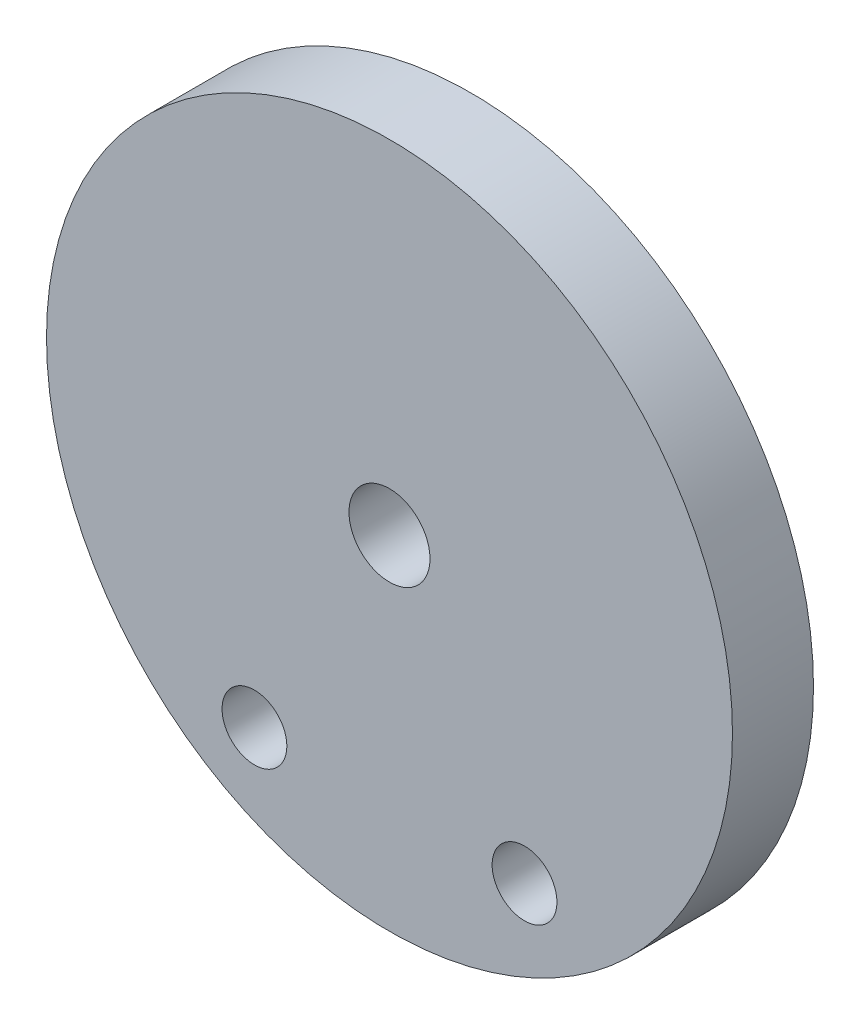
ISO-10303-21;
HEADER;
FILE_DESCRIPTION(('STEP AP214'),'2;1');
FILE_NAME('part.step','',(''),(''),'','','');
FILE_SCHEMA(('AUTOMOTIVE_DESIGN { 1 0 10303 214 1 1 1 1 }'));
ENDSEC;
DATA;
#1=APPLICATION_CONTEXT('core data for automotive mechanical design processes');
#2=APPLICATION_PROTOCOL_DEFINITION('international standard','automotive_design',2000,#1);
#3=PRODUCT_CONTEXT('',#1,'mechanical');
#4=PRODUCT('Part','Part','',(#3));
#5=PRODUCT_RELATED_PRODUCT_CATEGORY('part','',(#4));
#6=PRODUCT_DEFINITION_FORMATION('','',#4);
#7=PRODUCT_DEFINITION_CONTEXT('part definition',#1,'design');
#8=PRODUCT_DEFINITION('design','',#6,#7);
#9=PRODUCT_DEFINITION_SHAPE('','',#8);
#10=(LENGTH_UNIT() NAMED_UNIT(*) SI_UNIT(.MILLI.,.METRE.));
#11=(NAMED_UNIT(*) PLANE_ANGLE_UNIT() SI_UNIT($,.RADIAN.));
#12=(NAMED_UNIT(*) SI_UNIT($,.STERADIAN.) SOLID_ANGLE_UNIT());
#13=UNCERTAINTY_MEASURE_WITH_UNIT(LENGTH_MEASURE(1.E-05),#10,'distance_accuracy_value','');
#14=(GEOMETRIC_REPRESENTATION_CONTEXT(3) GLOBAL_UNCERTAINTY_ASSIGNED_CONTEXT((#13)) GLOBAL_UNIT_ASSIGNED_CONTEXT((#10,
#11,#12)) REPRESENTATION_CONTEXT('',''));
#15=CARTESIAN_POINT('',(0.,0.,0.));
#16=DIRECTION('',(0.,0.,1.));
#17=DIRECTION('',(1.,0.,0.));
#18=AXIS2_PLACEMENT_3D('',#15,#16,#17);
#19=CARTESIAN_POINT('',(0.,0.,3.));
#20=DIRECTION('',(0.,0.,1.));
#21=DIRECTION('',(1.,0.,0.));
#22=AXIS2_PLACEMENT_3D('',#19,#20,#21);
#23=PLANE('',#22);
#24=CARTESIAN_POINT('',(5.,-8.66,3.));
#25=DIRECTION('',(0.,0.,1.));
#26=DIRECTION('',(1.,0.,0.));
#27=AXIS2_PLACEMENT_3D('',#24,#25,#26);
#28=CIRCLE('',#27,1.2);
#29=CARTESIAN_POINT('',(6.2,-8.66,3.));
#30=VERTEX_POINT('',#29);
#31=EDGE_CURVE('E52',#30,#30,#28,.T.);
#32=ORIENTED_EDGE('',*,*,#31,.F.);
#33=EDGE_LOOP('',(#32));
#34=FACE_BOUND('',#33,.T.);
#35=CARTESIAN_POINT('',(0.,0.,3.));
#36=DIRECTION('',(0.,0.,1.));
#37=DIRECTION('',(1.,0.,0.));
#38=AXIS2_PLACEMENT_3D('',#35,#36,#37);
#39=CIRCLE('',#38,12.7);
#40=CARTESIAN_POINT('',(12.7,0.,3.));
#41=VERTEX_POINT('',#40);
#42=EDGE_CURVE('E10',#41,#41,#39,.T.);
#43=ORIENTED_EDGE('',*,*,#42,.T.);
#44=EDGE_LOOP('',(#43));
#45=FACE_BOUND('',#44,.T.);
#46=CARTESIAN_POINT('',(0.,0.,3.));
#47=DIRECTION('',(0.,0.,1.));
#48=DIRECTION('',(1.,0.,0.));
#49=AXIS2_PLACEMENT_3D('',#46,#47,#48);
#50=CIRCLE('',#49,1.5);
#51=CARTESIAN_POINT('',(1.5,0.,3.));
#52=VERTEX_POINT('',#51);
#53=EDGE_CURVE('E48',#52,#52,#50,.T.);
#54=ORIENTED_EDGE('',*,*,#53,.F.);
#55=EDGE_LOOP('',(#54));
#56=FACE_BOUND('',#55,.T.);
#57=CARTESIAN_POINT('',(-5.,-8.66,3.));
#58=DIRECTION('',(0.,0.,1.));
#59=DIRECTION('',(1.,0.,0.));
#60=AXIS2_PLACEMENT_3D('',#57,#58,#59);
#61=CIRCLE('',#60,1.2);
#62=CARTESIAN_POINT('',(-3.8,-8.66,3.));
#63=VERTEX_POINT('',#62);
#64=EDGE_CURVE('E56',#63,#63,#61,.T.);
#65=ORIENTED_EDGE('',*,*,#64,.F.);
#66=EDGE_LOOP('',(#65));
#67=FACE_BOUND('',#66,.T.);
#68=ADVANCED_FACE('F40',(#34,#45,#56,#67),#23,.T.);
#69=CARTESIAN_POINT('',(0.,0.,0.));
#70=DIRECTION('',(0.,0.,1.));
#71=DIRECTION('',(1.,0.,0.));
#72=AXIS2_PLACEMENT_3D('',#69,#70,#71);
#73=PLANE('',#72);
#74=CARTESIAN_POINT('',(0.,0.,0.));
#75=DIRECTION('',(0.,0.,1.));
#76=DIRECTION('',(1.,0.,0.));
#77=AXIS2_PLACEMENT_3D('',#74,#75,#76);
#78=CIRCLE('',#77,12.7);
#79=CARTESIAN_POINT('',(12.7,0.,0.));
#80=VERTEX_POINT('',#79);
#81=EDGE_CURVE('E41',#80,#80,#78,.T.);
#82=ORIENTED_EDGE('',*,*,#81,.F.);
#83=EDGE_LOOP('',(#82));
#84=FACE_BOUND('',#83,.T.);
#85=CARTESIAN_POINT('',(0.,0.,0.));
#86=DIRECTION('',(0.,0.,1.));
#87=DIRECTION('',(1.,0.,0.));
#88=AXIS2_PLACEMENT_3D('',#85,#86,#87);
#89=CIRCLE('',#88,1.5);
#90=CARTESIAN_POINT('',(1.5,0.,0.));
#91=VERTEX_POINT('',#90);
#92=EDGE_CURVE('E49',#91,#91,#89,.T.);
#93=ORIENTED_EDGE('',*,*,#92,.T.);
#94=EDGE_LOOP('',(#93));
#95=FACE_BOUND('',#94,.T.);
#96=CARTESIAN_POINT('',(5.,-8.66,0.));
#97=DIRECTION('',(0.,0.,1.));
#98=DIRECTION('',(1.,0.,0.));
#99=AXIS2_PLACEMENT_3D('',#96,#97,#98);
#100=CIRCLE('',#99,1.2);
#101=CARTESIAN_POINT('',(6.2,-8.66,0.));
#102=VERTEX_POINT('',#101);
#103=EDGE_CURVE('E57',#102,#102,#100,.T.);
#104=ORIENTED_EDGE('',*,*,#103,.T.);
#105=EDGE_LOOP('',(#104));
#106=FACE_BOUND('',#105,.T.);
#107=CARTESIAN_POINT('',(-5.,-8.66,0.));
#108=DIRECTION('',(0.,0.,1.));
#109=DIRECTION('',(1.,0.,0.));
#110=AXIS2_PLACEMENT_3D('',#107,#108,#109);
#111=CIRCLE('',#110,1.2);
#112=CARTESIAN_POINT('',(-3.8,-8.66,0.));
#113=VERTEX_POINT('',#112);
#114=EDGE_CURVE('E65',#113,#113,#111,.T.);
#115=ORIENTED_EDGE('',*,*,#114,.T.);
#116=EDGE_LOOP('',(#115));
#117=FACE_BOUND('',#116,.T.);
#118=ADVANCED_FACE('F75',(#84,#95,#106,#117),#73,.F.);
#119=CARTESIAN_POINT('',(0.,0.,3.));
#120=DIRECTION('',(0.,0.,-1.));
#121=DIRECTION('',(-1.,0.,0.));
#122=AXIS2_PLACEMENT_3D('',#119,#120,#121);
#123=CYLINDRICAL_SURFACE('',#122,12.7);
#124=ORIENTED_EDGE('',*,*,#42,.F.);
#125=EDGE_LOOP('',(#124));
#126=FACE_BOUND('',#125,.T.);
#127=ORIENTED_EDGE('',*,*,#81,.T.);
#128=EDGE_LOOP('',(#127));
#129=FACE_BOUND('',#128,.T.);
#130=ADVANCED_FACE('F39',(#126,#129),#123,.T.);
#131=CARTESIAN_POINT('',(0.,0.,3.));
#132=DIRECTION('',(0.,0.,-1.));
#133=DIRECTION('',(-1.,0.,0.));
#134=AXIS2_PLACEMENT_3D('',#131,#132,#133);
#135=CYLINDRICAL_SURFACE('',#134,1.5);
#136=ORIENTED_EDGE('',*,*,#53,.T.);
#137=EDGE_LOOP('',(#136));
#138=FACE_BOUND('',#137,.T.);
#139=ORIENTED_EDGE('',*,*,#92,.F.);
#140=EDGE_LOOP('',(#139));
#141=FACE_BOUND('',#140,.T.);
#142=ADVANCED_FACE('F81',(#138,#141),#135,.F.);
#143=CARTESIAN_POINT('',(5.,-8.66,3.));
#144=DIRECTION('',(0.,0.,-1.));
#145=DIRECTION('',(-1.,0.,0.));
#146=AXIS2_PLACEMENT_3D('',#143,#144,#145);
#147=CYLINDRICAL_SURFACE('',#146,1.2);
#148=ORIENTED_EDGE('',*,*,#31,.T.);
#149=EDGE_LOOP('',(#148));
#150=FACE_BOUND('',#149,.T.);
#151=ORIENTED_EDGE('',*,*,#103,.F.);
#152=EDGE_LOOP('',(#151));
#153=FACE_BOUND('',#152,.T.);
#154=ADVANCED_FACE('F83',(#150,#153),#147,.F.);
#155=CARTESIAN_POINT('',(-5.,-8.66,3.));
#156=DIRECTION('',(0.,0.,-1.));
#157=DIRECTION('',(-1.,0.,0.));
#158=AXIS2_PLACEMENT_3D('',#155,#156,#157);
#159=CYLINDRICAL_SURFACE('',#158,1.2);
#160=ORIENTED_EDGE('',*,*,#64,.T.);
#161=EDGE_LOOP('',(#160));
#162=FACE_BOUND('',#161,.T.);
#163=ORIENTED_EDGE('',*,*,#114,.F.);
#164=EDGE_LOOP('',(#163));
#165=FACE_BOUND('',#164,.T.);
#166=ADVANCED_FACE('F67',(#162,#165),#159,.F.);
#167=CLOSED_SHELL('',(#68,#118,#130,#142,#154,#166));
#168=MANIFOLD_SOLID_BREP('B2',#167);
#169=ADVANCED_BREP_SHAPE_REPRESENTATION('',(#18,#168),#14);
#170=SHAPE_DEFINITION_REPRESENTATION(#9,#169);
ENDSEC;
END-ISO-10303-21;
